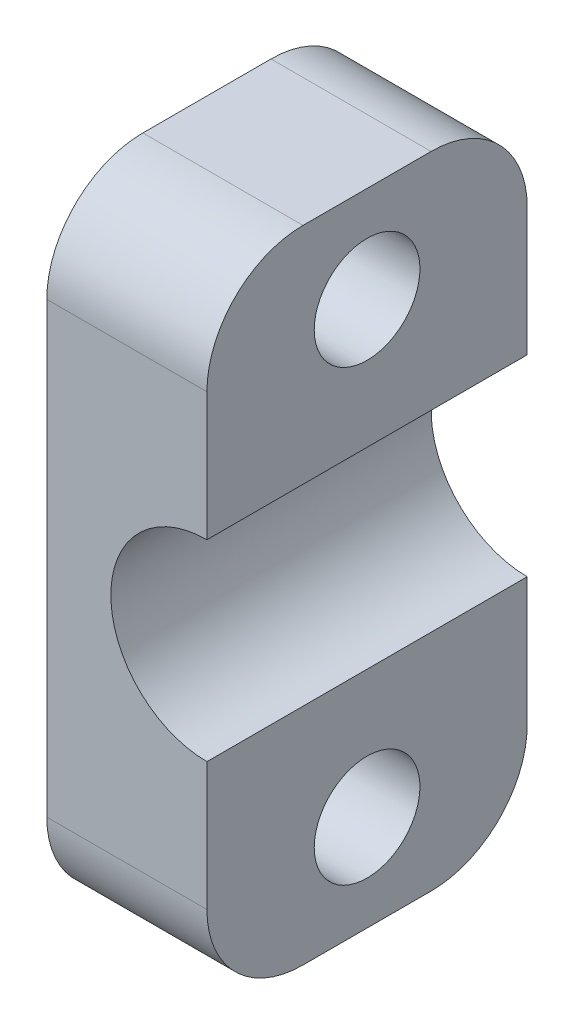
ISO-10303-21;
HEADER;
FILE_DESCRIPTION(('STEP AP214'),'2;1');
FILE_NAME('part.step','',(''),(''),'','','');
FILE_SCHEMA(('AUTOMOTIVE_DESIGN { 1 0 10303 214 1 1 1 1 }'));
ENDSEC;
DATA;
#1=APPLICATION_CONTEXT('core data for automotive mechanical design processes');
#2=APPLICATION_PROTOCOL_DEFINITION('international standard','automotive_design',2000,#1);
#3=PRODUCT_CONTEXT('',#1,'mechanical');
#4=PRODUCT('Part','Part','',(#3));
#5=PRODUCT_RELATED_PRODUCT_CATEGORY('part','',(#4));
#6=PRODUCT_DEFINITION_FORMATION('','',#4);
#7=PRODUCT_DEFINITION_CONTEXT('part definition',#1,'design');
#8=PRODUCT_DEFINITION('design','',#6,#7);
#9=PRODUCT_DEFINITION_SHAPE('','',#8);
#10=(LENGTH_UNIT() NAMED_UNIT(*) SI_UNIT(.MILLI.,.METRE.));
#11=(NAMED_UNIT(*) PLANE_ANGLE_UNIT() SI_UNIT($,.RADIAN.));
#12=(NAMED_UNIT(*) SI_UNIT($,.STERADIAN.) SOLID_ANGLE_UNIT());
#13=UNCERTAINTY_MEASURE_WITH_UNIT(LENGTH_MEASURE(1.E-05),#10,'distance_accuracy_value','');
#14=(GEOMETRIC_REPRESENTATION_CONTEXT(3) GLOBAL_UNCERTAINTY_ASSIGNED_CONTEXT((#13)) GLOBAL_UNIT_ASSIGNED_CONTEXT((#10,
#11,#12)) REPRESENTATION_CONTEXT('',''));
#15=CARTESIAN_POINT('',(0.,0.,0.));
#16=DIRECTION('',(0.,0.,1.));
#17=DIRECTION('',(1.,0.,0.));
#18=AXIS2_PLACEMENT_3D('',#15,#16,#17);
#19=CARTESIAN_POINT('',(0.,0.,10.));
#20=DIRECTION('',(0.,0.,1.));
#21=DIRECTION('',(1.,0.,0.));
#22=AXIS2_PLACEMENT_3D('',#19,#20,#21);
#23=PLANE('',#22);
#24=DIRECTION('',(0.,-1.,0.));
#25=VECTOR('',#24,1.);
#26=CARTESIAN_POINT('',(-5.,-10.,10.));
#27=LINE('',#26,#25);
#28=CARTESIAN_POINT('',(-5.,7.,10.));
#29=VERTEX_POINT('',#28);
#30=CARTESIAN_POINT('',(-5.,-7.,10.));
#31=VERTEX_POINT('',#30);
#32=EDGE_CURVE('E152',#29,#31,#27,.T.);
#33=ORIENTED_EDGE('',*,*,#32,.T.);
#34=DIRECTION('',(1.,0.,0.));
#35=VECTOR('',#34,1.);
#36=CARTESIAN_POINT('',(0.,-7.,10.));
#37=LINE('',#36,#35);
#38=CARTESIAN_POINT('',(0.,-7.,10.));
#39=VERTEX_POINT('',#38);
#40=EDGE_CURVE('E138',#31,#39,#37,.T.);
#41=ORIENTED_EDGE('',*,*,#40,.T.);
#42=DIRECTION('',(0.,-1.,0.));
#43=VECTOR('',#42,1.);
#44=CARTESIAN_POINT('',(0.,10.,10.));
#45=LINE('',#44,#43);
#46=CARTESIAN_POINT('',(0.,-3.,10.));
#47=VERTEX_POINT('',#46);
#48=EDGE_CURVE('E120',#47,#39,#45,.T.);
#49=ORIENTED_EDGE('',*,*,#48,.F.);
#50=CARTESIAN_POINT('',(0.,0.,10.));
#51=DIRECTION('',(0.,0.,1.));
#52=DIRECTION('',(1.,0.,0.));
#53=AXIS2_PLACEMENT_3D('',#50,#51,#52);
#54=CIRCLE('',#53,3.);
#55=CARTESIAN_POINT('',(0.,3.,10.));
#56=VERTEX_POINT('',#55);
#57=EDGE_CURVE('E136',#56,#47,#54,.T.);
#58=ORIENTED_EDGE('',*,*,#57,.F.);
#59=CARTESIAN_POINT('',(0.,7.,10.));
#60=VERTEX_POINT('',#59);
#61=EDGE_CURVE('E140',#60,#56,#45,.T.);
#62=ORIENTED_EDGE('',*,*,#61,.F.);
#63=DIRECTION('',(-1.,0.,0.));
#64=VECTOR('',#63,1.);
#65=CARTESIAN_POINT('',(-5.,7.,10.));
#66=LINE('',#65,#64);
#67=EDGE_CURVE('E170',#60,#29,#66,.T.);
#68=ORIENTED_EDGE('',*,*,#67,.T.);
#69=EDGE_LOOP('',(#33,#41,#49,#58,#62,#68));
#70=FACE_BOUND('',#69,.T.);
#71=ADVANCED_FACE('F39',(#70),#23,.T.);
#72=CARTESIAN_POINT('',(0.,0.,0.));
#73=DIRECTION('',(0.,0.,1.));
#74=DIRECTION('',(1.,0.,0.));
#75=AXIS2_PLACEMENT_3D('',#72,#73,#74);
#76=PLANE('',#75);
#77=DIRECTION('',(0.,-1.,0.));
#78=VECTOR('',#77,1.);
#79=CARTESIAN_POINT('',(0.,10.,0.));
#80=LINE('',#79,#78);
#81=CARTESIAN_POINT('',(0.,-3.,0.));
#82=VERTEX_POINT('',#81);
#83=CARTESIAN_POINT('',(0.,-7.,0.));
#84=VERTEX_POINT('',#83);
#85=EDGE_CURVE('E122',#82,#84,#80,.T.);
#86=ORIENTED_EDGE('',*,*,#85,.T.);
#87=DIRECTION('',(1.,0.,0.));
#88=VECTOR('',#87,1.);
#89=CARTESIAN_POINT('',(0.,-7.,0.));
#90=LINE('',#89,#88);
#91=CARTESIAN_POINT('',(-5.,-7.,0.));
#92=VERTEX_POINT('',#91);
#93=EDGE_CURVE('E209',#84,#92,#90,.F.);
#94=ORIENTED_EDGE('',*,*,#93,.T.);
#95=DIRECTION('',(0.,-1.,0.));
#96=VECTOR('',#95,1.);
#97=CARTESIAN_POINT('',(-5.,-10.,0.));
#98=LINE('',#97,#96);
#99=CARTESIAN_POINT('',(-5.,7.,0.));
#100=VERTEX_POINT('',#99);
#101=EDGE_CURVE('E146',#100,#92,#98,.T.);
#102=ORIENTED_EDGE('',*,*,#101,.F.);
#103=DIRECTION('',(-1.,0.,0.));
#104=VECTOR('',#103,1.);
#105=CARTESIAN_POINT('',(0.,7.,0.));
#106=LINE('',#105,#104);
#107=CARTESIAN_POINT('',(0.,7.,0.));
#108=VERTEX_POINT('',#107);
#109=EDGE_CURVE('E206',#100,#108,#106,.F.);
#110=ORIENTED_EDGE('',*,*,#109,.T.);
#111=CARTESIAN_POINT('',(0.,3.,0.));
#112=VERTEX_POINT('',#111);
#113=EDGE_CURVE('E384',#108,#112,#80,.T.);
#114=ORIENTED_EDGE('',*,*,#113,.T.);
#115=CARTESIAN_POINT('',(0.,0.,0.));
#116=DIRECTION('',(0.,0.,1.));
#117=DIRECTION('',(1.,0.,0.));
#118=AXIS2_PLACEMENT_3D('',#115,#116,#117);
#119=CIRCLE('',#118,3.);
#120=EDGE_CURVE('E147',#112,#82,#119,.T.);
#121=ORIENTED_EDGE('',*,*,#120,.T.);
#122=EDGE_LOOP('',(#86,#94,#102,#110,#114,#121));
#123=FACE_BOUND('',#122,.T.);
#124=ADVANCED_FACE('F236',(#123),#76,.F.);
#125=CARTESIAN_POINT('',(-5.,-10.,10.));
#126=DIRECTION('',(1.,0.,0.));
#127=DIRECTION('',(0.,0.,-1.));
#128=AXIS2_PLACEMENT_3D('',#125,#126,#127);
#129=PLANE('',#128);
#130=CARTESIAN_POINT('',(-5.,7.,5.));
#131=DIRECTION('',(-1.,0.,0.));
#132=DIRECTION('',(0.,0.,1.));
#133=AXIS2_PLACEMENT_3D('',#130,#131,#132);
#134=CIRCLE('',#133,1.65);
#135=CARTESIAN_POINT('',(-5.,7.,6.65));
#136=VERTEX_POINT('',#135);
#137=EDGE_CURVE('E154',#136,#136,#134,.T.);
#138=ORIENTED_EDGE('',*,*,#137,.F.);
#139=EDGE_LOOP('',(#138));
#140=FACE_BOUND('',#139,.T.);
#141=CARTESIAN_POINT('',(-5.,-7.,5.));
#142=DIRECTION('',(-1.,0.,0.));
#143=DIRECTION('',(0.,0.,1.));
#144=AXIS2_PLACEMENT_3D('',#141,#142,#143);
#145=CIRCLE('',#144,1.65);
#146=CARTESIAN_POINT('',(-5.,-7.,6.65));
#147=VERTEX_POINT('',#146);
#148=EDGE_CURVE('E157',#147,#147,#145,.T.);
#149=ORIENTED_EDGE('',*,*,#148,.F.);
#150=EDGE_LOOP('',(#149));
#151=FACE_BOUND('',#150,.T.);
#152=DIRECTION('',(0.,0.,-1.));
#153=VECTOR('',#152,1.);
#154=CARTESIAN_POINT('',(-5.,-10.,10.));
#155=LINE('',#154,#153);
#156=CARTESIAN_POINT('',(-5.,-10.,7.));
#157=VERTEX_POINT('',#156);
#158=CARTESIAN_POINT('',(-5.,-10.,3.));
#159=VERTEX_POINT('',#158);
#160=EDGE_CURVE('E166',#157,#159,#155,.T.);
#161=ORIENTED_EDGE('',*,*,#160,.F.);
#162=CARTESIAN_POINT('',(-5.,-7.,7.));
#163=DIRECTION('',(1.,0.,0.));
#164=DIRECTION('',(0.,0.,-1.));
#165=AXIS2_PLACEMENT_3D('',#162,#163,#164);
#166=CIRCLE('',#165,3.);
#167=EDGE_CURVE('E203',#157,#31,#166,.F.);
#168=ORIENTED_EDGE('',*,*,#167,.T.);
#169=ORIENTED_EDGE('',*,*,#32,.F.);
#170=CARTESIAN_POINT('',(-5.,7.,7.));
#171=DIRECTION('',(1.,0.,0.));
#172=DIRECTION('',(0.,0.,-1.));
#173=AXIS2_PLACEMENT_3D('',#170,#171,#172);
#174=CIRCLE('',#173,3.);
#175=CARTESIAN_POINT('',(-5.,10.,7.));
#176=VERTEX_POINT('',#175);
#177=EDGE_CURVE('E194',#29,#176,#174,.F.);
#178=ORIENTED_EDGE('',*,*,#177,.T.);
#179=DIRECTION('',(0.,0.,-1.));
#180=VECTOR('',#179,1.);
#181=CARTESIAN_POINT('',(-5.,10.,10.));
#182=LINE('',#181,#180);
#183=CARTESIAN_POINT('',(-5.,10.,3.));
#184=VERTEX_POINT('',#183);
#185=EDGE_CURVE('E161',#176,#184,#182,.T.);
#186=ORIENTED_EDGE('',*,*,#185,.T.);
#187=CARTESIAN_POINT('',(-5.,7.,3.));
#188=DIRECTION('',(1.,0.,0.));
#189=DIRECTION('',(0.,0.,-1.));
#190=AXIS2_PLACEMENT_3D('',#187,#188,#189);
#191=CIRCLE('',#190,3.);
#192=EDGE_CURVE('E197',#184,#100,#191,.F.);
#193=ORIENTED_EDGE('',*,*,#192,.T.);
#194=ORIENTED_EDGE('',*,*,#101,.T.);
#195=CARTESIAN_POINT('',(-5.,-7.,3.));
#196=DIRECTION('',(1.,0.,0.));
#197=DIRECTION('',(0.,0.,-1.));
#198=AXIS2_PLACEMENT_3D('',#195,#196,#197);
#199=CIRCLE('',#198,3.);
#200=EDGE_CURVE('E200',#92,#159,#199,.F.);
#201=ORIENTED_EDGE('',*,*,#200,.T.);
#202=EDGE_LOOP('',(#161,#168,#169,#178,#186,#193,#194,#201));
#203=FACE_BOUND('',#202,.T.);
#204=ADVANCED_FACE('F227',(#140,#151,#203),#129,.F.);
#205=CARTESIAN_POINT('',(5.,-10.,10.));
#206=DIRECTION('',(0.,1.,0.));
#207=DIRECTION('',(0.,0.,1.));
#208=AXIS2_PLACEMENT_3D('',#205,#206,#207);
#209=PLANE('',#208);
#210=DIRECTION('',(0.,0.,1.));
#211=VECTOR('',#210,1.);
#212=CARTESIAN_POINT('',(0.,-10.,10.));
#213=LINE('',#212,#211);
#214=CARTESIAN_POINT('',(0.,-10.,3.));
#215=VERTEX_POINT('',#214);
#216=CARTESIAN_POINT('',(0.,-10.,7.));
#217=VERTEX_POINT('',#216);
#218=EDGE_CURVE('E247',#215,#217,#213,.T.);
#219=ORIENTED_EDGE('',*,*,#218,.T.);
#220=DIRECTION('',(1.,0.,0.));
#221=VECTOR('',#220,1.);
#222=CARTESIAN_POINT('',(-5.,-10.,7.));
#223=LINE('',#222,#221);
#224=EDGE_CURVE('E191',#217,#157,#223,.F.);
#225=ORIENTED_EDGE('',*,*,#224,.T.);
#226=ORIENTED_EDGE('',*,*,#160,.T.);
#227=DIRECTION('',(1.,0.,0.));
#228=VECTOR('',#227,1.);
#229=CARTESIAN_POINT('',(5.,-10.,3.));
#230=LINE('',#229,#228);
#231=EDGE_CURVE('E187',#159,#215,#230,.T.);
#232=ORIENTED_EDGE('',*,*,#231,.T.);
#233=EDGE_LOOP('',(#219,#225,#226,#232));
#234=FACE_BOUND('',#233,.T.);
#235=ADVANCED_FACE('F244',(#234),#209,.F.);
#236=CARTESIAN_POINT('',(5.,10.,10.));
#237=DIRECTION('',(0.,-1.,0.));
#238=DIRECTION('',(0.,0.,-1.));
#239=AXIS2_PLACEMENT_3D('',#236,#237,#238);
#240=PLANE('',#239);
#241=DIRECTION('',(0.,0.,1.));
#242=VECTOR('',#241,1.);
#243=CARTESIAN_POINT('',(0.,10.,0.));
#244=LINE('',#243,#242);
#245=CARTESIAN_POINT('',(0.,10.,3.));
#246=VERTEX_POINT('',#245);
#247=CARTESIAN_POINT('',(0.,10.,7.));
#248=VERTEX_POINT('',#247);
#249=EDGE_CURVE('E175',#246,#248,#244,.T.);
#250=ORIENTED_EDGE('',*,*,#249,.F.);
#251=DIRECTION('',(-1.,0.,0.));
#252=VECTOR('',#251,1.);
#253=CARTESIAN_POINT('',(5.,10.,3.));
#254=LINE('',#253,#252);
#255=EDGE_CURVE('E214',#246,#184,#254,.T.);
#256=ORIENTED_EDGE('',*,*,#255,.T.);
#257=ORIENTED_EDGE('',*,*,#185,.F.);
#258=DIRECTION('',(-1.,0.,0.));
#259=VECTOR('',#258,1.);
#260=CARTESIAN_POINT('',(0.,10.,7.));
#261=LINE('',#260,#259);
#262=EDGE_CURVE('E55',#176,#248,#261,.F.);
#263=ORIENTED_EDGE('',*,*,#262,.T.);
#264=EDGE_LOOP('',(#250,#256,#257,#263));
#265=FACE_BOUND('',#264,.T.);
#266=ADVANCED_FACE('F228',(#265),#240,.F.);
#267=CARTESIAN_POINT('',(0.,0.,10.));
#268=DIRECTION('',(0.,0.,-1.));
#269=DIRECTION('',(-1.,0.,0.));
#270=AXIS2_PLACEMENT_3D('',#267,#268,#269);
#271=CYLINDRICAL_SURFACE('',#270,3.);
#272=DIRECTION('',(0.,0.,-1.));
#273=VECTOR('',#272,1.);
#274=CARTESIAN_POINT('',(0.,3.,10.));
#275=LINE('',#274,#273);
#276=EDGE_CURVE('E128',#56,#112,#275,.T.);
#277=ORIENTED_EDGE('',*,*,#276,.F.);
#278=ORIENTED_EDGE('',*,*,#57,.T.);
#279=DIRECTION('',(0.,0.,-1.));
#280=VECTOR('',#279,1.);
#281=CARTESIAN_POINT('',(0.,-3.,10.));
#282=LINE('',#281,#280);
#283=EDGE_CURVE('E117',#82,#47,#282,.F.);
#284=ORIENTED_EDGE('',*,*,#283,.F.);
#285=ORIENTED_EDGE('',*,*,#120,.F.);
#286=EDGE_LOOP('',(#277,#278,#284,#285));
#287=FACE_BOUND('',#286,.T.);
#288=ADVANCED_FACE('F143',(#287),#271,.F.);
#289=CARTESIAN_POINT('',(5.,-7.,5.));
#290=DIRECTION('',(-1.,0.,0.));
#291=DIRECTION('',(0.,0.,1.));
#292=AXIS2_PLACEMENT_3D('',#289,#290,#291);
#293=CYLINDRICAL_SURFACE('',#292,1.65);
#294=CARTESIAN_POINT('',(0.,-7.,5.));
#295=DIRECTION('',(-1.,0.,0.));
#296=DIRECTION('',(0.,0.,1.));
#297=AXIS2_PLACEMENT_3D('',#294,#295,#296);
#298=CIRCLE('',#297,1.65);
#299=CARTESIAN_POINT('',(0.,-7.,6.65));
#300=VERTEX_POINT('',#299);
#301=EDGE_CURVE('E129',#300,#300,#298,.F.);
#302=ORIENTED_EDGE('',*,*,#301,.T.);
#303=EDGE_LOOP('',(#302));
#304=FACE_BOUND('',#303,.T.);
#305=ORIENTED_EDGE('',*,*,#148,.T.);
#306=EDGE_LOOP('',(#305));
#307=FACE_BOUND('',#306,.T.);
#308=ADVANCED_FACE('F267',(#304,#307),#293,.F.);
#309=CARTESIAN_POINT('',(5.,7.,5.));
#310=DIRECTION('',(-1.,0.,0.));
#311=DIRECTION('',(0.,0.,1.));
#312=AXIS2_PLACEMENT_3D('',#309,#310,#311);
#313=CYLINDRICAL_SURFACE('',#312,1.65);
#314=CARTESIAN_POINT('',(0.,7.,5.));
#315=DIRECTION('',(-1.,0.,0.));
#316=DIRECTION('',(0.,0.,1.));
#317=AXIS2_PLACEMENT_3D('',#314,#315,#316);
#318=CIRCLE('',#317,1.65);
#319=CARTESIAN_POINT('',(0.,7.,6.65));
#320=VERTEX_POINT('',#319);
#321=EDGE_CURVE('E171',#320,#320,#318,.F.);
#322=ORIENTED_EDGE('',*,*,#321,.T.);
#323=EDGE_LOOP('',(#322));
#324=FACE_BOUND('',#323,.T.);
#325=ORIENTED_EDGE('',*,*,#137,.T.);
#326=EDGE_LOOP('',(#325));
#327=FACE_BOUND('',#326,.T.);
#328=ADVANCED_FACE('F260',(#324,#327),#313,.F.);
#329=CARTESIAN_POINT('',(0.,10.,0.));
#330=DIRECTION('',(-1.,0.,0.));
#331=DIRECTION('',(0.,0.,1.));
#332=AXIS2_PLACEMENT_3D('',#329,#330,#331);
#333=PLANE('',#332);
#334=ORIENTED_EDGE('',*,*,#113,.F.);
#335=CARTESIAN_POINT('',(0.,7.,3.));
#336=DIRECTION('',(-1.,0.,0.));
#337=DIRECTION('',(0.,0.,1.));
#338=AXIS2_PLACEMENT_3D('',#335,#336,#337);
#339=CIRCLE('',#338,3.);
#340=EDGE_CURVE('E11',#108,#246,#339,.F.);
#341=ORIENTED_EDGE('',*,*,#340,.T.);
#342=ORIENTED_EDGE('',*,*,#249,.T.);
#343=CARTESIAN_POINT('',(0.,7.,7.));
#344=DIRECTION('',(-1.,0.,0.));
#345=DIRECTION('',(0.,0.,1.));
#346=AXIS2_PLACEMENT_3D('',#343,#344,#345);
#347=CIRCLE('',#346,3.);
#348=EDGE_CURVE('E48',#248,#60,#347,.F.);
#349=ORIENTED_EDGE('',*,*,#348,.T.);
#350=ORIENTED_EDGE('',*,*,#61,.T.);
#351=ORIENTED_EDGE('',*,*,#276,.T.);
#352=EDGE_LOOP('',(#334,#341,#342,#349,#350,#351));
#353=FACE_BOUND('',#352,.T.);
#354=ORIENTED_EDGE('',*,*,#321,.F.);
#355=EDGE_LOOP('',(#354));
#356=FACE_BOUND('',#355,.T.);
#357=ADVANCED_FACE('F219',(#353,#356),#333,.F.);
#358=ORIENTED_EDGE('',*,*,#301,.F.);
#359=EDGE_LOOP('',(#358));
#360=FACE_BOUND('',#359,.T.);
#361=ORIENTED_EDGE('',*,*,#48,.T.);
#362=CARTESIAN_POINT('',(0.,-7.,7.));
#363=DIRECTION('',(-1.,0.,0.));
#364=DIRECTION('',(0.,0.,1.));
#365=AXIS2_PLACEMENT_3D('',#362,#363,#364);
#366=CIRCLE('',#365,3.);
#367=EDGE_CURVE('E184',#39,#217,#366,.F.);
#368=ORIENTED_EDGE('',*,*,#367,.T.);
#369=ORIENTED_EDGE('',*,*,#218,.F.);
#370=CARTESIAN_POINT('',(0.,-7.,3.));
#371=DIRECTION('',(-1.,0.,0.));
#372=DIRECTION('',(0.,0.,1.));
#373=AXIS2_PLACEMENT_3D('',#370,#371,#372);
#374=CIRCLE('',#373,3.);
#375=EDGE_CURVE('E181',#215,#84,#374,.F.);
#376=ORIENTED_EDGE('',*,*,#375,.T.);
#377=ORIENTED_EDGE('',*,*,#85,.F.);
#378=ORIENTED_EDGE('',*,*,#283,.T.);
#379=EDGE_LOOP('',(#361,#368,#369,#376,#377,#378));
#380=FACE_BOUND('',#379,.T.);
#381=ADVANCED_FACE('F119',(#360,#380),#333,.F.);
#382=CARTESIAN_POINT('',(0.,-7.,7.));
#383=DIRECTION('',(-1.,0.,0.));
#384=DIRECTION('',(0.,0.,1.));
#385=AXIS2_PLACEMENT_3D('',#382,#383,#384);
#386=CYLINDRICAL_SURFACE('',#385,3.);
#387=ORIENTED_EDGE('',*,*,#167,.F.);
#388=ORIENTED_EDGE('',*,*,#224,.F.);
#389=ORIENTED_EDGE('',*,*,#367,.F.);
#390=ORIENTED_EDGE('',*,*,#40,.F.);
#391=EDGE_LOOP('',(#387,#388,#389,#390));
#392=FACE_BOUND('',#391,.T.);
#393=ADVANCED_FACE('F249',(#392),#386,.T.);
#394=CARTESIAN_POINT('',(5.,-7.,3.));
#395=DIRECTION('',(1.,0.,0.));
#396=DIRECTION('',(0.,0.,-1.));
#397=AXIS2_PLACEMENT_3D('',#394,#395,#396);
#398=CYLINDRICAL_SURFACE('',#397,3.);
#399=ORIENTED_EDGE('',*,*,#200,.F.);
#400=ORIENTED_EDGE('',*,*,#93,.F.);
#401=ORIENTED_EDGE('',*,*,#375,.F.);
#402=ORIENTED_EDGE('',*,*,#231,.F.);
#403=EDGE_LOOP('',(#399,#400,#401,#402));
#404=FACE_BOUND('',#403,.T.);
#405=ADVANCED_FACE('F239',(#404),#398,.T.);
#406=CARTESIAN_POINT('',(5.,7.,3.));
#407=DIRECTION('',(-1.,0.,0.));
#408=DIRECTION('',(0.,0.,1.));
#409=AXIS2_PLACEMENT_3D('',#406,#407,#408);
#410=CYLINDRICAL_SURFACE('',#409,3.);
#411=ORIENTED_EDGE('',*,*,#340,.F.);
#412=ORIENTED_EDGE('',*,*,#109,.F.);
#413=ORIENTED_EDGE('',*,*,#192,.F.);
#414=ORIENTED_EDGE('',*,*,#255,.F.);
#415=EDGE_LOOP('',(#411,#412,#413,#414));
#416=FACE_BOUND('',#415,.T.);
#417=ADVANCED_FACE('F231',(#416),#410,.T.);
#418=CARTESIAN_POINT('',(0.,7.,7.));
#419=DIRECTION('',(1.,0.,0.));
#420=DIRECTION('',(0.,0.,-1.));
#421=AXIS2_PLACEMENT_3D('',#418,#419,#420);
#422=CYLINDRICAL_SURFACE('',#421,3.);
#423=ORIENTED_EDGE('',*,*,#348,.F.);
#424=ORIENTED_EDGE('',*,*,#262,.F.);
#425=ORIENTED_EDGE('',*,*,#177,.F.);
#426=ORIENTED_EDGE('',*,*,#67,.F.);
#427=EDGE_LOOP('',(#423,#424,#425,#426));
#428=FACE_BOUND('',#427,.T.);
#429=ADVANCED_FACE('F41',(#428),#422,.T.);
#430=CLOSED_SHELL('',(#71,#124,#204,#235,#266,#288,#308,#328,#357,#381,#393,#405,#417,#429));
#431=MANIFOLD_SOLID_BREP('B2',#430);
#432=ADVANCED_BREP_SHAPE_REPRESENTATION('',(#18,#431),#14);
#433=SHAPE_DEFINITION_REPRESENTATION(#9,#432);
ENDSEC;
END-ISO-10303-21;
